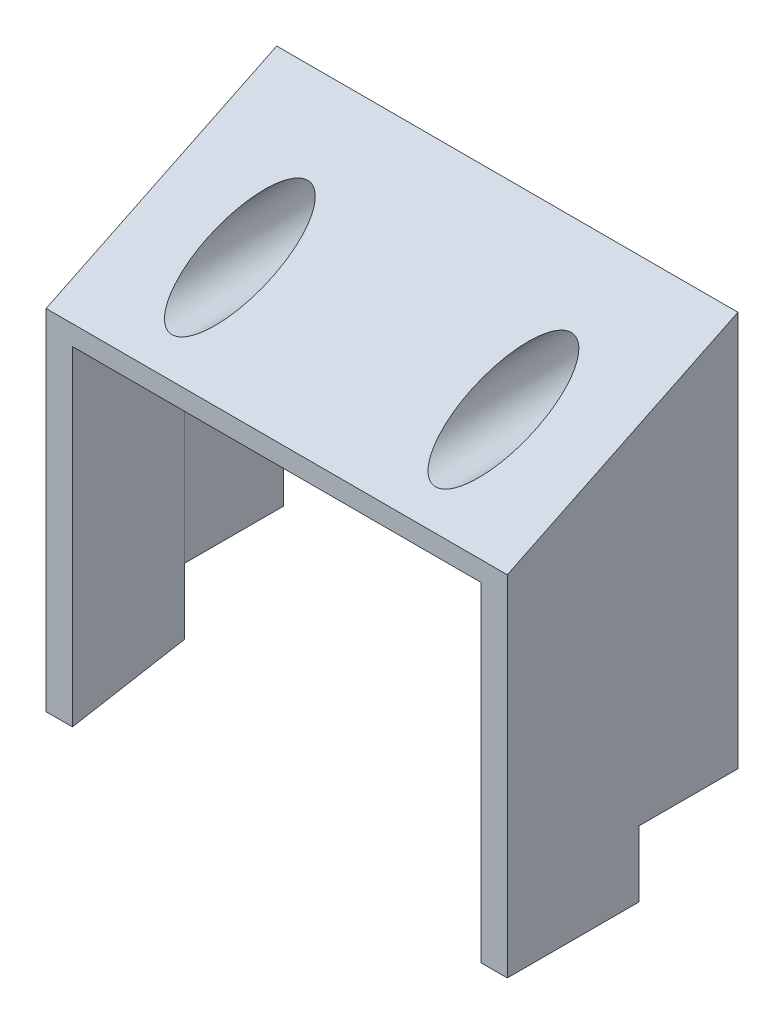
ISO-10303-21;
HEADER;
FILE_DESCRIPTION(('STEP AP214'),'2;1');
FILE_NAME('part.step','',(''),(''),'','','');
FILE_SCHEMA(('AUTOMOTIVE_DESIGN { 1 0 10303 214 1 1 1 1 }'));
ENDSEC;
DATA;
#1=APPLICATION_CONTEXT('core data for automotive mechanical design processes');
#2=APPLICATION_PROTOCOL_DEFINITION('international standard','automotive_design',2000,#1);
#3=PRODUCT_CONTEXT('',#1,'mechanical');
#4=PRODUCT('Part','Part','',(#3));
#5=PRODUCT_RELATED_PRODUCT_CATEGORY('part','',(#4));
#6=PRODUCT_DEFINITION_FORMATION('','',#4);
#7=PRODUCT_DEFINITION_CONTEXT('part definition',#1,'design');
#8=PRODUCT_DEFINITION('design','',#6,#7);
#9=PRODUCT_DEFINITION_SHAPE('','',#8);
#10=(LENGTH_UNIT() NAMED_UNIT(*) SI_UNIT(.MILLI.,.METRE.));
#11=(NAMED_UNIT(*) PLANE_ANGLE_UNIT() SI_UNIT($,.RADIAN.));
#12=(NAMED_UNIT(*) SI_UNIT($,.STERADIAN.) SOLID_ANGLE_UNIT());
#13=UNCERTAINTY_MEASURE_WITH_UNIT(LENGTH_MEASURE(1.E-05),#10,'distance_accuracy_value','');
#14=(GEOMETRIC_REPRESENTATION_CONTEXT(3) GLOBAL_UNCERTAINTY_ASSIGNED_CONTEXT((#13)) GLOBAL_UNIT_ASSIGNED_CONTEXT((#10,
#11,#12)) REPRESENTATION_CONTEXT('',''));
#15=CARTESIAN_POINT('',(0.,0.,0.));
#16=DIRECTION('',(0.,0.,1.));
#17=DIRECTION('',(1.,0.,0.));
#18=AXIS2_PLACEMENT_3D('',#15,#16,#17);
#19=CARTESIAN_POINT('',(-35.,-10.,3.));
#20=DIRECTION('',(0.,1.,0.));
#21=DIRECTION('',(0.,0.,1.));
#22=AXIS2_PLACEMENT_3D('',#19,#20,#21);
#23=PLANE('',#22);
#24=DIRECTION('',(0.148340452930245,0.,-0.988936352868298));
#25=VECTOR('',#24,1.);
#26=CARTESIAN_POINT('',(31.,-10.,35.));
#27=LINE('',#26,#25);
#28=CARTESIAN_POINT('',(31.,-10.,35.));
#29=VERTEX_POINT('',#28);
#30=CARTESIAN_POINT('',(34.,-10.,15.));
#31=VERTEX_POINT('',#30);
#32=EDGE_CURVE('E198',#29,#31,#27,.T.);
#33=ORIENTED_EDGE('',*,*,#32,.F.);
#34=DIRECTION('',(-1.,0.,0.));
#35=VECTOR('',#34,1.);
#36=CARTESIAN_POINT('',(-35.,-10.,35.));
#37=LINE('',#36,#35);
#38=CARTESIAN_POINT('',(-31.,-10.,35.));
#39=VERTEX_POINT('',#38);
#40=EDGE_CURVE('E229',#29,#39,#37,.T.);
#41=ORIENTED_EDGE('',*,*,#40,.T.);
#42=DIRECTION('',(0.148340452930245,0.,0.988936352868298));
#43=VECTOR('',#42,1.);
#44=CARTESIAN_POINT('',(-34.,-10.,15.));
#45=LINE('',#44,#43);
#46=CARTESIAN_POINT('',(-34.,-10.,15.));
#47=VERTEX_POINT('',#46);
#48=EDGE_CURVE('E211',#47,#39,#45,.T.);
#49=ORIENTED_EDGE('',*,*,#48,.F.);
#50=DIRECTION('',(0.,0.,1.));
#51=VECTOR('',#50,1.);
#52=CARTESIAN_POINT('',(-34.,-10.,0.));
#53=LINE('',#52,#51);
#54=CARTESIAN_POINT('',(-34.,-10.,0.));
#55=VERTEX_POINT('',#54);
#56=EDGE_CURVE('E201',#55,#47,#53,.T.);
#57=ORIENTED_EDGE('',*,*,#56,.F.);
#58=DIRECTION('',(1.,0.,0.));
#59=VECTOR('',#58,1.);
#60=CARTESIAN_POINT('',(-35.,-10.,0.));
#61=LINE('',#60,#59);
#62=CARTESIAN_POINT('',(34.,-10.,0.));
#63=VERTEX_POINT('',#62);
#64=EDGE_CURVE('E48',#55,#63,#61,.T.);
#65=ORIENTED_EDGE('',*,*,#64,.T.);
#66=DIRECTION('',(0.,0.,-1.));
#67=VECTOR('',#66,1.);
#68=CARTESIAN_POINT('',(34.,-10.,0.));
#69=LINE('',#68,#67);
#70=EDGE_CURVE('E196',#31,#63,#69,.T.);
#71=ORIENTED_EDGE('',*,*,#70,.F.);
#72=EDGE_LOOP('',(#33,#41,#49,#57,#65,#71));
#73=FACE_BOUND('',#72,.T.);
#74=ADVANCED_FACE('F40',(#73),#23,.F.);
#75=CARTESIAN_POINT('',(0.,0.,0.));
#76=DIRECTION('',(0.,0.,1.));
#77=DIRECTION('',(1.,0.,0.));
#78=AXIS2_PLACEMENT_3D('',#75,#76,#77);
#79=PLANE('',#78);
#80=DIRECTION('',(0.,1.,0.));
#81=VECTOR('',#80,1.);
#82=CARTESIAN_POINT('',(35.,10.,0.));
#83=LINE('',#82,#81);
#84=CARTESIAN_POINT('',(35.,-50.,0.));
#85=VERTEX_POINT('',#84);
#86=CARTESIAN_POINT('',(35.,10.,0.));
#87=VERTEX_POINT('',#86);
#88=EDGE_CURVE('E244',#85,#87,#83,.T.);
#89=ORIENTED_EDGE('',*,*,#88,.F.);
#90=DIRECTION('',(-1.,0.,0.));
#91=VECTOR('',#90,1.);
#92=CARTESIAN_POINT('',(35.,-50.,0.));
#93=LINE('',#92,#91);
#94=CARTESIAN_POINT('',(34.,-50.,0.));
#95=VERTEX_POINT('',#94);
#96=EDGE_CURVE('E147',#85,#95,#93,.T.);
#97=ORIENTED_EDGE('',*,*,#96,.T.);
#98=DIRECTION('',(0.,1.,0.));
#99=VECTOR('',#98,1.);
#100=CARTESIAN_POINT('',(34.,-60.,0.));
#101=LINE('',#100,#99);
#102=EDGE_CURVE('E193',#95,#63,#101,.T.);
#103=ORIENTED_EDGE('',*,*,#102,.T.);
#104=ORIENTED_EDGE('',*,*,#64,.F.);
#105=DIRECTION('',(0.,1.,0.));
#106=VECTOR('',#105,1.);
#107=CARTESIAN_POINT('',(-34.,-60.,0.));
#108=LINE('',#107,#106);
#109=CARTESIAN_POINT('',(-34.,-50.,0.));
#110=VERTEX_POINT('',#109);
#111=EDGE_CURVE('E227',#110,#55,#108,.T.);
#112=ORIENTED_EDGE('',*,*,#111,.F.);
#113=CARTESIAN_POINT('',(-35.,-50.,0.));
#114=VERTEX_POINT('',#113);
#115=EDGE_CURVE('E140',#110,#114,#93,.T.);
#116=ORIENTED_EDGE('',*,*,#115,.T.);
#117=DIRECTION('',(0.,-1.,0.));
#118=VECTOR('',#117,1.);
#119=CARTESIAN_POINT('',(-35.,10.,0.));
#120=LINE('',#119,#118);
#121=CARTESIAN_POINT('',(-35.,10.,0.));
#122=VERTEX_POINT('',#121);
#123=EDGE_CURVE('E248',#122,#114,#120,.T.);
#124=ORIENTED_EDGE('',*,*,#123,.F.);
#125=DIRECTION('',(-1.,0.,0.));
#126=VECTOR('',#125,1.);
#127=CARTESIAN_POINT('',(-35.,10.,0.));
#128=LINE('',#127,#126);
#129=EDGE_CURVE('E246',#87,#122,#128,.T.);
#130=ORIENTED_EDGE('',*,*,#129,.F.);
#131=EDGE_LOOP('',(#89,#97,#103,#104,#112,#116,#124,#130));
#132=FACE_BOUND('',#131,.T.);
#133=CARTESIAN_POINT('',(-20.,0.,0.));
#134=DIRECTION('',(0.,0.,1.));
#135=DIRECTION('',(1.,0.,0.));
#136=AXIS2_PLACEMENT_3D('',#133,#134,#135);
#137=CIRCLE('',#136,3.);
#138=CARTESIAN_POINT('',(-17.,0.,0.));
#139=VERTEX_POINT('',#138);
#140=EDGE_CURVE('E241',#139,#139,#137,.T.);
#141=ORIENTED_EDGE('',*,*,#140,.T.);
#142=EDGE_LOOP('',(#141));
#143=FACE_BOUND('',#142,.T.);
#144=CARTESIAN_POINT('',(20.,0.,0.));
#145=DIRECTION('',(0.,0.,1.));
#146=DIRECTION('',(1.,0.,0.));
#147=AXIS2_PLACEMENT_3D('',#144,#145,#146);
#148=CIRCLE('',#147,3.);
#149=CARTESIAN_POINT('',(23.,0.,0.));
#150=VERTEX_POINT('',#149);
#151=EDGE_CURVE('E237',#150,#150,#148,.T.);
#152=ORIENTED_EDGE('',*,*,#151,.T.);
#153=EDGE_LOOP('',(#152));
#154=FACE_BOUND('',#153,.T.);
#155=ADVANCED_FACE('F286',(#132,#143,#154),#79,.F.);
#156=CARTESIAN_POINT('',(35.,10.,3.));
#157=DIRECTION('',(-1.,0.,0.));
#158=DIRECTION('',(0.,0.,1.));
#159=AXIS2_PLACEMENT_3D('',#156,#157,#158);
#160=PLANE('',#159);
#161=DIRECTION('',(0.,1.,0.));
#162=VECTOR('',#161,1.);
#163=CARTESIAN_POINT('',(35.,-60.,15.));
#164=LINE('',#163,#162);
#165=CARTESIAN_POINT('',(35.,-60.,15.));
#166=VERTEX_POINT('',#165);
#167=CARTESIAN_POINT('',(35.,-50.,15.));
#168=VERTEX_POINT('',#167);
#169=EDGE_CURVE('E55',#166,#168,#164,.T.);
#170=ORIENTED_EDGE('',*,*,#169,.T.);
#171=DIRECTION('',(0.,0.,-1.));
#172=VECTOR('',#171,1.);
#173=CARTESIAN_POINT('',(35.,-50.,0.));
#174=LINE('',#173,#172);
#175=EDGE_CURVE('E144',#168,#85,#174,.T.);
#176=ORIENTED_EDGE('',*,*,#175,.T.);
#177=ORIENTED_EDGE('',*,*,#88,.T.);
#178=DIRECTION('',(0.,-0.436903962736913,0.899508158575998));
#179=VECTOR('',#178,1.);
#180=CARTESIAN_POINT('',(35.,10.,0.));
#181=LINE('',#180,#179);
#182=CARTESIAN_POINT('',(35.,-7.,35.));
#183=VERTEX_POINT('',#182);
#184=EDGE_CURVE('E169',#87,#183,#181,.T.);
#185=ORIENTED_EDGE('',*,*,#184,.T.);
#186=DIRECTION('',(0.,-1.,0.));
#187=VECTOR('',#186,1.);
#188=CARTESIAN_POINT('',(35.,-7.,35.));
#189=LINE('',#188,#187);
#190=CARTESIAN_POINT('',(35.,-60.,35.));
#191=VERTEX_POINT('',#190);
#192=EDGE_CURVE('E233',#183,#191,#189,.T.);
#193=ORIENTED_EDGE('',*,*,#192,.T.);
#194=DIRECTION('',(0.,0.,1.));
#195=VECTOR('',#194,1.);
#196=CARTESIAN_POINT('',(35.,-60.,0.));
#197=LINE('',#196,#195);
#198=EDGE_CURVE('E154',#166,#191,#197,.T.);
#199=ORIENTED_EDGE('',*,*,#198,.F.);
#200=EDGE_LOOP('',(#170,#176,#177,#185,#193,#199));
#201=FACE_BOUND('',#200,.T.);
#202=ADVANCED_FACE('F42',(#201),#160,.F.);
#203=CARTESIAN_POINT('',(-35.,10.,3.));
#204=DIRECTION('',(1.,0.,0.));
#205=DIRECTION('',(0.,0.,-1.));
#206=AXIS2_PLACEMENT_3D('',#203,#204,#205);
#207=PLANE('',#206);
#208=ORIENTED_EDGE('',*,*,#123,.T.);
#209=DIRECTION('',(0.,0.,-1.));
#210=VECTOR('',#209,1.);
#211=CARTESIAN_POINT('',(-35.,-50.,0.));
#212=LINE('',#211,#210);
#213=CARTESIAN_POINT('',(-35.,-50.,15.));
#214=VERTEX_POINT('',#213);
#215=EDGE_CURVE('E155',#214,#114,#212,.T.);
#216=ORIENTED_EDGE('',*,*,#215,.F.);
#217=DIRECTION('',(0.,1.,0.));
#218=VECTOR('',#217,1.);
#219=CARTESIAN_POINT('',(-35.,-60.,15.));
#220=LINE('',#219,#218);
#221=CARTESIAN_POINT('',(-35.,-60.,15.));
#222=VERTEX_POINT('',#221);
#223=EDGE_CURVE('E157',#222,#214,#220,.T.);
#224=ORIENTED_EDGE('',*,*,#223,.F.);
#225=DIRECTION('',(0.,0.,-1.));
#226=VECTOR('',#225,1.);
#227=CARTESIAN_POINT('',(-35.,-60.,0.));
#228=LINE('',#227,#226);
#229=CARTESIAN_POINT('',(-35.,-60.,35.));
#230=VERTEX_POINT('',#229);
#231=EDGE_CURVE('E207',#230,#222,#228,.T.);
#232=ORIENTED_EDGE('',*,*,#231,.F.);
#233=DIRECTION('',(0.,-1.,0.));
#234=VECTOR('',#233,1.);
#235=CARTESIAN_POINT('',(-35.,-7.,35.));
#236=LINE('',#235,#234);
#237=CARTESIAN_POINT('',(-35.,-7.,35.));
#238=VERTEX_POINT('',#237);
#239=EDGE_CURVE('E235',#238,#230,#236,.T.);
#240=ORIENTED_EDGE('',*,*,#239,.F.);
#241=DIRECTION('',(0.,-0.436903962736913,0.899508158575998));
#242=VECTOR('',#241,1.);
#243=CARTESIAN_POINT('',(-35.,10.,0.));
#244=LINE('',#243,#242);
#245=EDGE_CURVE('E168',#122,#238,#244,.T.);
#246=ORIENTED_EDGE('',*,*,#245,.F.);
#247=EDGE_LOOP('',(#208,#216,#224,#232,#240,#246));
#248=FACE_BOUND('',#247,.T.);
#249=ADVANCED_FACE('F297',(#248),#207,.F.);
#250=CARTESIAN_POINT('',(-20.,0.,3.));
#251=DIRECTION('',(0.,0.,-1.));
#252=DIRECTION('',(-1.,0.,0.));
#253=AXIS2_PLACEMENT_3D('',#250,#251,#252);
#254=CYLINDRICAL_SURFACE('',#253,3.);
#255=CARTESIAN_POINT('',(-20.,0.,3.));
#256=DIRECTION('',(0.,0.,-1.));
#257=DIRECTION('',(-1.,0.,0.));
#258=AXIS2_PLACEMENT_3D('',#255,#256,#257);
#259=CIRCLE('',#258,3.);
#260=CARTESIAN_POINT('',(-23.,0.,3.));
#261=VERTEX_POINT('',#260);
#262=EDGE_CURVE('E181',#261,#261,#259,.T.);
#263=ORIENTED_EDGE('',*,*,#262,.F.);
#264=EDGE_LOOP('',(#263));
#265=FACE_BOUND('',#264,.T.);
#266=ORIENTED_EDGE('',*,*,#140,.F.);
#267=EDGE_LOOP('',(#266));
#268=FACE_BOUND('',#267,.T.);
#269=ADVANCED_FACE('F299',(#265,#268),#254,.F.);
#270=CARTESIAN_POINT('',(20.,0.,3.));
#271=DIRECTION('',(0.,0.,-1.));
#272=DIRECTION('',(-1.,0.,0.));
#273=AXIS2_PLACEMENT_3D('',#270,#271,#272);
#274=CYLINDRICAL_SURFACE('',#273,3.);
#275=CARTESIAN_POINT('',(20.,0.,3.));
#276=DIRECTION('',(0.,0.,-1.));
#277=DIRECTION('',(-1.,0.,0.));
#278=AXIS2_PLACEMENT_3D('',#275,#276,#277);
#279=CIRCLE('',#278,3.);
#280=CARTESIAN_POINT('',(17.,0.,3.));
#281=VERTEX_POINT('',#280);
#282=EDGE_CURVE('E184',#281,#281,#279,.T.);
#283=ORIENTED_EDGE('',*,*,#282,.F.);
#284=EDGE_LOOP('',(#283));
#285=FACE_BOUND('',#284,.T.);
#286=ORIENTED_EDGE('',*,*,#151,.F.);
#287=EDGE_LOOP('',(#286));
#288=FACE_BOUND('',#287,.T.);
#289=ADVANCED_FACE('F306',(#285,#288),#274,.F.);
#290=CARTESIAN_POINT('',(-35.,-7.,35.));
#291=DIRECTION('',(0.,0.,1.));
#292=DIRECTION('',(1.,0.,0.));
#293=AXIS2_PLACEMENT_3D('',#290,#291,#292);
#294=PLANE('',#293);
#295=ORIENTED_EDGE('',*,*,#40,.F.);
#296=DIRECTION('',(0.,1.,0.));
#297=VECTOR('',#296,1.);
#298=CARTESIAN_POINT('',(31.,-60.,35.));
#299=LINE('',#298,#297);
#300=CARTESIAN_POINT('',(31.,-60.,35.));
#301=VERTEX_POINT('',#300);
#302=EDGE_CURVE('E187',#301,#29,#299,.T.);
#303=ORIENTED_EDGE('',*,*,#302,.F.);
#304=DIRECTION('',(-1.,0.,0.));
#305=VECTOR('',#304,1.);
#306=CARTESIAN_POINT('',(35.,-60.,35.));
#307=LINE('',#306,#305);
#308=EDGE_CURVE('E204',#191,#301,#307,.T.);
#309=ORIENTED_EDGE('',*,*,#308,.F.);
#310=ORIENTED_EDGE('',*,*,#192,.F.);
#311=DIRECTION('',(-1.,0.,0.));
#312=VECTOR('',#311,1.);
#313=CARTESIAN_POINT('',(-35.,-7.,35.));
#314=LINE('',#313,#312);
#315=EDGE_CURVE('E230',#183,#238,#314,.T.);
#316=ORIENTED_EDGE('',*,*,#315,.T.);
#317=ORIENTED_EDGE('',*,*,#239,.T.);
#318=DIRECTION('',(-1.,0.,0.));
#319=VECTOR('',#318,1.);
#320=CARTESIAN_POINT('',(-31.,-60.,35.));
#321=LINE('',#320,#319);
#322=CARTESIAN_POINT('',(-31.,-60.,35.));
#323=VERTEX_POINT('',#322);
#324=EDGE_CURVE('E213',#323,#230,#321,.T.);
#325=ORIENTED_EDGE('',*,*,#324,.F.);
#326=DIRECTION('',(0.,1.,0.));
#327=VECTOR('',#326,1.);
#328=CARTESIAN_POINT('',(-31.,-60.,35.));
#329=LINE('',#328,#327);
#330=EDGE_CURVE('E216',#323,#39,#329,.T.);
#331=ORIENTED_EDGE('',*,*,#330,.T.);
#332=EDGE_LOOP('',(#295,#303,#309,#310,#316,#317,#325,#331));
#333=FACE_BOUND('',#332,.T.);
#334=ADVANCED_FACE('F337',(#333),#294,.T.);
#335=CARTESIAN_POINT('',(-34.,-60.,0.));
#336=DIRECTION('',(-1.,0.,0.));
#337=DIRECTION('',(0.,0.,1.));
#338=AXIS2_PLACEMENT_3D('',#335,#336,#337);
#339=PLANE('',#338);
#340=DIRECTION('',(0.,1.,0.));
#341=VECTOR('',#340,1.);
#342=CARTESIAN_POINT('',(-34.,-60.,15.));
#343=LINE('',#342,#341);
#344=CARTESIAN_POINT('',(-34.,-50.,15.));
#345=VERTEX_POINT('',#344);
#346=EDGE_CURVE('E223',#345,#47,#343,.T.);
#347=ORIENTED_EDGE('',*,*,#346,.F.);
#348=DIRECTION('',(0.,0.,-1.));
#349=VECTOR('',#348,1.);
#350=CARTESIAN_POINT('',(-34.,-50.,0.));
#351=LINE('',#350,#349);
#352=EDGE_CURVE('E162',#345,#110,#351,.T.);
#353=ORIENTED_EDGE('',*,*,#352,.T.);
#354=ORIENTED_EDGE('',*,*,#111,.T.);
#355=ORIENTED_EDGE('',*,*,#56,.T.);
#356=EDGE_LOOP('',(#347,#353,#354,#355));
#357=FACE_BOUND('',#356,.T.);
#358=ADVANCED_FACE('F321',(#357),#339,.F.);
#359=CARTESIAN_POINT('',(-34.,-60.,15.));
#360=DIRECTION('',(-0.988936352868298,0.,0.148340452930245));
#361=DIRECTION('',(0.148340452930245,0.,0.988936352868298));
#362=AXIS2_PLACEMENT_3D('',#359,#360,#361);
#363=PLANE('',#362);
#364=ORIENTED_EDGE('',*,*,#48,.T.);
#365=ORIENTED_EDGE('',*,*,#330,.F.);
#366=DIRECTION('',(0.148340452930245,0.,0.988936352868298));
#367=VECTOR('',#366,1.);
#368=CARTESIAN_POINT('',(-34.,-60.,15.));
#369=LINE('',#368,#367);
#370=CARTESIAN_POINT('',(-34.,-60.,15.));
#371=VERTEX_POINT('',#370);
#372=EDGE_CURVE('E210',#371,#323,#369,.T.);
#373=ORIENTED_EDGE('',*,*,#372,.F.);
#374=EDGE_CURVE('E224',#371,#345,#343,.T.);
#375=ORIENTED_EDGE('',*,*,#374,.T.);
#376=ORIENTED_EDGE('',*,*,#346,.T.);
#377=EDGE_LOOP('',(#364,#365,#373,#375,#376));
#378=FACE_BOUND('',#377,.T.);
#379=ADVANCED_FACE('F326',(#378),#363,.F.);
#380=CARTESIAN_POINT('',(0.,-60.,0.));
#381=DIRECTION('',(0.,-1.,0.));
#382=DIRECTION('',(0.,0.,-1.));
#383=AXIS2_PLACEMENT_3D('',#380,#381,#382);
#384=PLANE('',#383);
#385=DIRECTION('',(-1.,0.,0.));
#386=VECTOR('',#385,1.);
#387=CARTESIAN_POINT('',(35.,-60.,15.));
#388=LINE('',#387,#386);
#389=EDGE_CURVE('E150',#371,#222,#388,.T.);
#390=ORIENTED_EDGE('',*,*,#389,.F.);
#391=ORIENTED_EDGE('',*,*,#372,.T.);
#392=ORIENTED_EDGE('',*,*,#324,.T.);
#393=ORIENTED_EDGE('',*,*,#231,.T.);
#394=EDGE_LOOP('',(#390,#391,#392,#393));
#395=FACE_BOUND('',#394,.T.);
#396=ADVANCED_FACE('F332',(#395),#384,.T.);
#397=CARTESIAN_POINT('',(31.,-60.,35.));
#398=DIRECTION('',(0.988936352868298,0.,0.148340452930245));
#399=DIRECTION('',(0.148340452930245,0.,-0.988936352868298));
#400=AXIS2_PLACEMENT_3D('',#397,#398,#399);
#401=PLANE('',#400);
#402=ORIENTED_EDGE('',*,*,#32,.T.);
#403=DIRECTION('',(0.,1.,0.));
#404=VECTOR('',#403,1.);
#405=CARTESIAN_POINT('',(34.,-60.,15.));
#406=LINE('',#405,#404);
#407=CARTESIAN_POINT('',(34.,-50.,15.));
#408=VERTEX_POINT('',#407);
#409=EDGE_CURVE('E62',#408,#31,#406,.T.);
#410=ORIENTED_EDGE('',*,*,#409,.F.);
#411=CARTESIAN_POINT('',(34.,-60.,15.));
#412=VERTEX_POINT('',#411);
#413=EDGE_CURVE('E138',#412,#408,#406,.T.);
#414=ORIENTED_EDGE('',*,*,#413,.F.);
#415=DIRECTION('',(0.148340452930245,0.,-0.988936352868298));
#416=VECTOR('',#415,1.);
#417=CARTESIAN_POINT('',(31.,-60.,35.));
#418=LINE('',#417,#416);
#419=EDGE_CURVE('E195',#301,#412,#418,.T.);
#420=ORIENTED_EDGE('',*,*,#419,.F.);
#421=ORIENTED_EDGE('',*,*,#302,.T.);
#422=EDGE_LOOP('',(#402,#410,#414,#420,#421));
#423=FACE_BOUND('',#422,.T.);
#424=ADVANCED_FACE('F343',(#423),#401,.F.);
#425=CARTESIAN_POINT('',(34.,-60.,0.));
#426=DIRECTION('',(1.,0.,0.));
#427=DIRECTION('',(0.,0.,-1.));
#428=AXIS2_PLACEMENT_3D('',#425,#426,#427);
#429=PLANE('',#428);
#430=ORIENTED_EDGE('',*,*,#102,.F.);
#431=DIRECTION('',(0.,0.,1.));
#432=VECTOR('',#431,1.);
#433=CARTESIAN_POINT('',(34.,-50.,0.));
#434=LINE('',#433,#432);
#435=EDGE_CURVE('E11',#95,#408,#434,.T.);
#436=ORIENTED_EDGE('',*,*,#435,.T.);
#437=ORIENTED_EDGE('',*,*,#409,.T.);
#438=ORIENTED_EDGE('',*,*,#70,.T.);
#439=EDGE_LOOP('',(#430,#436,#437,#438));
#440=FACE_BOUND('',#439,.T.);
#441=ADVANCED_FACE('F341',(#440),#429,.F.);
#442=CARTESIAN_POINT('',(0.,-60.,0.));
#443=DIRECTION('',(0.,-1.,0.));
#444=DIRECTION('',(0.,0.,-1.));
#445=AXIS2_PLACEMENT_3D('',#442,#443,#444);
#446=PLANE('',#445);
#447=EDGE_CURVE('E164',#166,#412,#388,.T.);
#448=ORIENTED_EDGE('',*,*,#447,.F.);
#449=ORIENTED_EDGE('',*,*,#198,.T.);
#450=ORIENTED_EDGE('',*,*,#308,.T.);
#451=ORIENTED_EDGE('',*,*,#419,.T.);
#452=EDGE_LOOP('',(#448,#449,#450,#451));
#453=FACE_BOUND('',#452,.T.);
#454=ADVANCED_FACE('F272',(#453),#446,.T.);
#455=CARTESIAN_POINT('',(-20.,0.,33.));
#456=DIRECTION('',(0.,0.,-1.));
#457=DIRECTION('',(-1.,0.,0.));
#458=AXIS2_PLACEMENT_3D('',#455,#456,#457);
#459=CYLINDRICAL_SURFACE('',#458,5.);
#460=CARTESIAN_POINT('',(-20.,0.,20.5882352941176));
#461=DIRECTION('',(0.,-0.899508158575998,-0.436903962736913));
#462=DIRECTION('',(0.,0.436903962736913,-0.899508158575998));
#463=AXIS2_PLACEMENT_3D('',#460,#461,#462);
#464=ELLIPSE('',#463,11.4441626225551,5.);
#465=CARTESIAN_POINT('',(-20.,5.,10.2941176470588));
#466=VERTEX_POINT('',#465);
#467=EDGE_CURVE('E174',#466,#466,#464,.F.);
#468=ORIENTED_EDGE('',*,*,#467,.T.);
#469=EDGE_LOOP('',(#468));
#470=FACE_BOUND('',#469,.T.);
#471=CARTESIAN_POINT('',(-20.,0.,3.));
#472=DIRECTION('',(0.,0.,-1.));
#473=DIRECTION('',(-1.,0.,0.));
#474=AXIS2_PLACEMENT_3D('',#471,#472,#473);
#475=CIRCLE('',#474,5.);
#476=CARTESIAN_POINT('',(-25.,0.,3.));
#477=VERTEX_POINT('',#476);
#478=EDGE_CURVE('E177',#477,#477,#475,.T.);
#479=ORIENTED_EDGE('',*,*,#478,.T.);
#480=EDGE_LOOP('',(#479));
#481=FACE_BOUND('',#480,.T.);
#482=ADVANCED_FACE('F268',(#470,#481),#459,.F.);
#483=CARTESIAN_POINT('',(-20.,0.,3.));
#484=DIRECTION('',(0.,0.,-1.));
#485=DIRECTION('',(-1.,0.,0.));
#486=AXIS2_PLACEMENT_3D('',#483,#484,#485);
#487=PLANE('',#486);
#488=ORIENTED_EDGE('',*,*,#262,.T.);
#489=EDGE_LOOP('',(#488));
#490=FACE_BOUND('',#489,.T.);
#491=ORIENTED_EDGE('',*,*,#478,.F.);
#492=EDGE_LOOP('',(#491));
#493=FACE_BOUND('',#492,.T.);
#494=ADVANCED_FACE('F271',(#490,#493),#487,.F.);
#495=CARTESIAN_POINT('',(20.,0.,33.));
#496=DIRECTION('',(0.,0.,-1.));
#497=DIRECTION('',(-1.,0.,0.));
#498=AXIS2_PLACEMENT_3D('',#495,#496,#497);
#499=CYLINDRICAL_SURFACE('',#498,5.);
#500=CARTESIAN_POINT('',(20.,0.,20.5882352941176));
#501=DIRECTION('',(0.,-0.899508158575998,-0.436903962736913));
#502=DIRECTION('',(0.,0.436903962736913,-0.899508158575998));
#503=AXIS2_PLACEMENT_3D('',#500,#501,#502);
#504=ELLIPSE('',#503,11.4441626225551,5.);
#505=CARTESIAN_POINT('',(20.,5.,10.2941176470588));
#506=VERTEX_POINT('',#505);
#507=EDGE_CURVE('E172',#506,#506,#504,.F.);
#508=ORIENTED_EDGE('',*,*,#507,.T.);
#509=EDGE_LOOP('',(#508));
#510=FACE_BOUND('',#509,.T.);
#511=CARTESIAN_POINT('',(20.,0.,3.));
#512=DIRECTION('',(0.,0.,-1.));
#513=DIRECTION('',(-1.,0.,0.));
#514=AXIS2_PLACEMENT_3D('',#511,#512,#513);
#515=CIRCLE('',#514,5.);
#516=CARTESIAN_POINT('',(15.,0.,3.));
#517=VERTEX_POINT('',#516);
#518=EDGE_CURVE('E178',#517,#517,#515,.T.);
#519=ORIENTED_EDGE('',*,*,#518,.T.);
#520=EDGE_LOOP('',(#519));
#521=FACE_BOUND('',#520,.T.);
#522=ADVANCED_FACE('F255',(#510,#521),#499,.F.);
#523=CARTESIAN_POINT('',(20.,0.,3.));
#524=DIRECTION('',(0.,0.,-1.));
#525=DIRECTION('',(-1.,0.,0.));
#526=AXIS2_PLACEMENT_3D('',#523,#524,#525);
#527=PLANE('',#526);
#528=ORIENTED_EDGE('',*,*,#282,.T.);
#529=EDGE_LOOP('',(#528));
#530=FACE_BOUND('',#529,.T.);
#531=ORIENTED_EDGE('',*,*,#518,.F.);
#532=EDGE_LOOP('',(#531));
#533=FACE_BOUND('',#532,.T.);
#534=ADVANCED_FACE('F261',(#530,#533),#527,.F.);
#535=CARTESIAN_POINT('',(35.,10.,0.));
#536=DIRECTION('',(0.,-0.899508158575998,-0.436903962736913));
#537=DIRECTION('',(0.,0.436903962736913,-0.899508158575998));
#538=AXIS2_PLACEMENT_3D('',#535,#536,#537);
#539=PLANE('',#538);
#540=ORIENTED_EDGE('',*,*,#507,.F.);
#541=EDGE_LOOP('',(#540));
#542=FACE_BOUND('',#541,.T.);
#543=ORIENTED_EDGE('',*,*,#245,.T.);
#544=ORIENTED_EDGE('',*,*,#315,.F.);
#545=ORIENTED_EDGE('',*,*,#184,.F.);
#546=ORIENTED_EDGE('',*,*,#129,.T.);
#547=EDGE_LOOP('',(#543,#544,#545,#546));
#548=FACE_BOUND('',#547,.T.);
#549=ORIENTED_EDGE('',*,*,#467,.F.);
#550=EDGE_LOOP('',(#549));
#551=FACE_BOUND('',#550,.T.);
#552=ADVANCED_FACE('F258',(#542,#548,#551),#539,.F.);
#553=CARTESIAN_POINT('',(35.,-60.,15.));
#554=DIRECTION('',(0.,0.,1.));
#555=DIRECTION('',(1.,0.,0.));
#556=AXIS2_PLACEMENT_3D('',#553,#554,#555);
#557=PLANE('',#556);
#558=DIRECTION('',(-1.,0.,0.));
#559=VECTOR('',#558,1.);
#560=CARTESIAN_POINT('',(35.,-50.,15.));
#561=LINE('',#560,#559);
#562=EDGE_CURVE('E134',#168,#408,#561,.T.);
#563=ORIENTED_EDGE('',*,*,#562,.F.);
#564=ORIENTED_EDGE('',*,*,#169,.F.);
#565=ORIENTED_EDGE('',*,*,#447,.T.);
#566=ORIENTED_EDGE('',*,*,#413,.T.);
#567=EDGE_LOOP('',(#563,#564,#565,#566));
#568=FACE_BOUND('',#567,.T.);
#569=ADVANCED_FACE('F136',(#568),#557,.F.);
#570=CARTESIAN_POINT('',(35.,-50.,0.));
#571=DIRECTION('',(0.,1.,0.));
#572=DIRECTION('',(0.,0.,1.));
#573=AXIS2_PLACEMENT_3D('',#570,#571,#572);
#574=PLANE('',#573);
#575=ORIENTED_EDGE('',*,*,#96,.F.);
#576=ORIENTED_EDGE('',*,*,#175,.F.);
#577=ORIENTED_EDGE('',*,*,#562,.T.);
#578=ORIENTED_EDGE('',*,*,#435,.F.);
#579=EDGE_LOOP('',(#575,#576,#577,#578));
#580=FACE_BOUND('',#579,.T.);
#581=ADVANCED_FACE('F145',(#580),#574,.F.);
#582=EDGE_CURVE('E141',#345,#214,#561,.T.);
#583=ORIENTED_EDGE('',*,*,#582,.T.);
#584=ORIENTED_EDGE('',*,*,#215,.T.);
#585=ORIENTED_EDGE('',*,*,#115,.F.);
#586=ORIENTED_EDGE('',*,*,#352,.F.);
#587=EDGE_LOOP('',(#583,#584,#585,#586));
#588=FACE_BOUND('',#587,.T.);
#589=ADVANCED_FACE('F317',(#588),#574,.F.);
#590=ORIENTED_EDGE('',*,*,#389,.T.);
#591=ORIENTED_EDGE('',*,*,#223,.T.);
#592=ORIENTED_EDGE('',*,*,#582,.F.);
#593=ORIENTED_EDGE('',*,*,#374,.F.);
#594=EDGE_LOOP('',(#590,#591,#592,#593));
#595=FACE_BOUND('',#594,.T.);
#596=ADVANCED_FACE('F330',(#595),#557,.F.);
#597=CLOSED_SHELL('',(#74,#155,#202,#249,#269,#289,#334,#358,#379,#396,#424,#441,#454,#482,#494,
#522,#534,#552,#569,#581,#589,#596));
#598=MANIFOLD_SOLID_BREP('B2',#597);
#599=ADVANCED_BREP_SHAPE_REPRESENTATION('',(#18,#598),#14);
#600=SHAPE_DEFINITION_REPRESENTATION(#9,#599);
ENDSEC;
END-ISO-10303-21;
